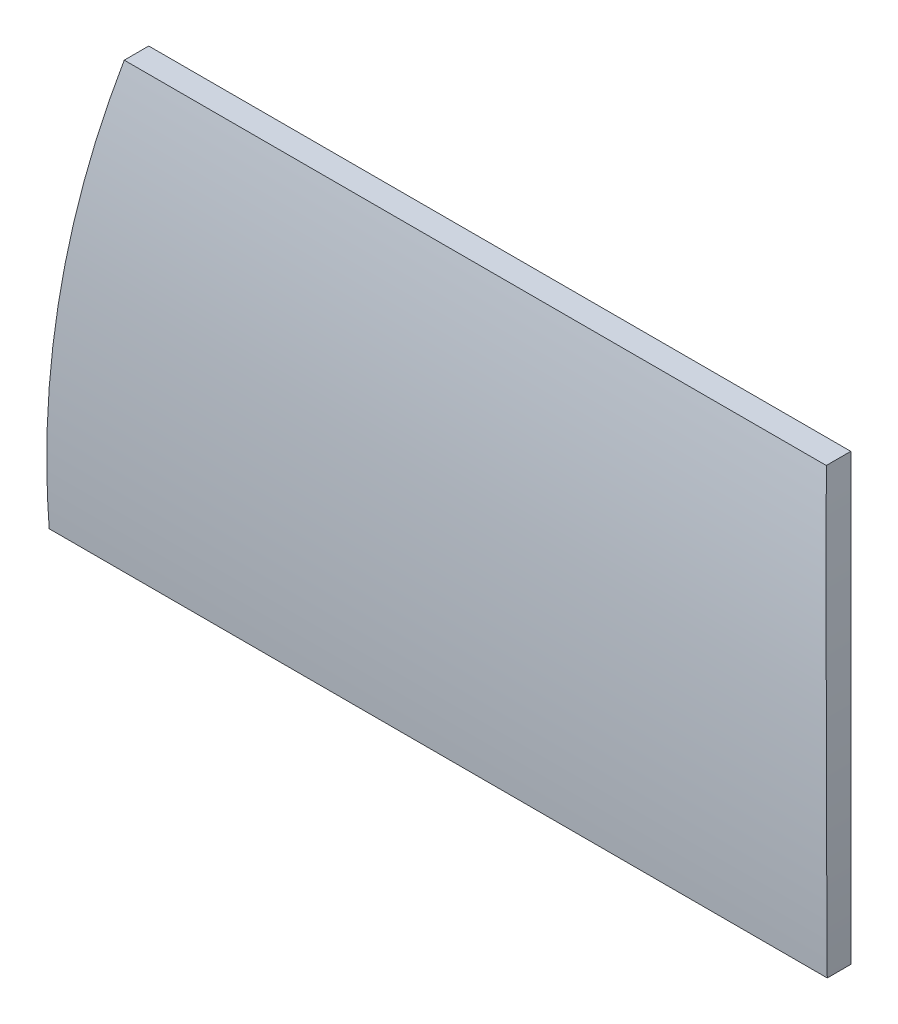
ISO-10303-21;
HEADER;
FILE_DESCRIPTION(('STEP AP214'),'2;1');
FILE_NAME('part.step','',(''),(''),'','','');
FILE_SCHEMA(('AUTOMOTIVE_DESIGN { 1 0 10303 214 1 1 1 1 }'));
ENDSEC;
DATA;
#1=APPLICATION_CONTEXT('core data for automotive mechanical design processes');
#2=APPLICATION_PROTOCOL_DEFINITION('international standard','automotive_design',2000,#1);
#3=PRODUCT_CONTEXT('',#1,'mechanical');
#4=PRODUCT('Part','Part','',(#3));
#5=PRODUCT_RELATED_PRODUCT_CATEGORY('part','',(#4));
#6=PRODUCT_DEFINITION_FORMATION('','',#4);
#7=PRODUCT_DEFINITION_CONTEXT('part definition',#1,'design');
#8=PRODUCT_DEFINITION('design','',#6,#7);
#9=PRODUCT_DEFINITION_SHAPE('','',#8);
#10=(LENGTH_UNIT() NAMED_UNIT(*) SI_UNIT(.MILLI.,.METRE.));
#11=(NAMED_UNIT(*) PLANE_ANGLE_UNIT() SI_UNIT($,.RADIAN.));
#12=(NAMED_UNIT(*) SI_UNIT($,.STERADIAN.) SOLID_ANGLE_UNIT());
#13=UNCERTAINTY_MEASURE_WITH_UNIT(LENGTH_MEASURE(1.E-05),#10,'distance_accuracy_value','');
#14=(GEOMETRIC_REPRESENTATION_CONTEXT(3) GLOBAL_UNCERTAINTY_ASSIGNED_CONTEXT((#13)) GLOBAL_UNIT_ASSIGNED_CONTEXT((#10,
#11,#12)) REPRESENTATION_CONTEXT('',''));
#15=CARTESIAN_POINT('',(0.,0.,0.));
#16=DIRECTION('',(0.,0.,1.));
#17=DIRECTION('',(1.,0.,0.));
#18=AXIS2_PLACEMENT_3D('',#15,#16,#17);
#19=CARTESIAN_POINT('',(5038.22117567225,182.044868634643,254.));
#20=DIRECTION('',(0.,0.,-1.));
#21=DIRECTION('',(-1.,0.,0.));
#22=AXIS2_PLACEMENT_3D('',#19,#20,#21);
#23=CYLINDRICAL_SURFACE('',#22,5041.50899525018);
#24=DIRECTION('',(0.,0.,-1.));
#25=VECTOR('',#24,1.);
#26=CARTESIAN_POINT('',(121.184130799503,1295.39999999999,254.));
#27=LINE('',#26,#25);
#28=CARTESIAN_POINT('',(121.184130799503,1295.4,-118.0703125));
#29=VERTEX_POINT('',#28);
#30=CARTESIAN_POINT('',(121.184130799503,1295.39999999999,-196.186778864413));
#31=VERTEX_POINT('',#30);
#32=EDGE_CURVE('E124',#29,#31,#27,.T.);
#33=ORIENTED_EDGE('',*,*,#32,.T.);
#34=CARTESIAN_POINT('',(121.184130799503,1295.4,-196.186778864414));
#35=CARTESIAN_POINT('',(118.221115439466,1282.31410462185,-193.224479559469));
#36=CARTESIAN_POINT('',(115.307918663472,1269.20567407987,-190.312389497769));
#37=CARTESIAN_POINT('',(109.581932582552,1242.94484784086,-184.589398003362));
#38=CARTESIAN_POINT('',(106.769143427457,1229.79245207826,-181.778496721651));
#39=CARTESIAN_POINT('',(98.4825772968622,1190.27113548249,-173.498765686505));
#40=CARTESIAN_POINT('',(93.1605786852689,1163.83798392849,-168.182885777828));
#41=CARTESIAN_POINT('',(82.9274486628202,1110.81084850003,-157.965117207028));
#42=CARTESIAN_POINT('',(78.0163458330862,1084.21685357535,-153.06325734312));
#43=CARTESIAN_POINT('',(68.6112513133622,1030.88137712413,-143.679773881506));
#44=CARTESIAN_POINT('',(64.1172580476436,1004.13989615516,-139.198148696265));
#45=CARTESIAN_POINT('',(55.5869880788214,950.741515216068,-130.69562823856));
#46=CARTESIAN_POINT('',(51.5472596707449,924.085720336932,-126.671255714952));
#47=CARTESIAN_POINT('',(43.888412007449,870.653330080227,-119.046199964671));
#48=CARTESIAN_POINT('',(40.2692929724297,843.876734639423,-115.44551695981));
#49=CARTESIAN_POINT('',(33.4562400780604,790.216171827955,-108.672420457143));
#50=CARTESIAN_POINT('',(30.2622952708098,763.332207240328,-105.499995931989));
#51=CARTESIAN_POINT('',(24.3034977992548,709.469416617735,-99.5873292916893));
#52=CARTESIAN_POINT('',(21.5386450652857,682.49059059817,-96.8470871063773));
#53=CARTESIAN_POINT('',(16.4412857213692,628.448674211627,-91.8020485178929));
#54=CARTESIAN_POINT('',(14.1088191901117,601.385576269495,-89.4972924803689));
#55=CARTESIAN_POINT('',(10.9369101230739,560.740734363327,-86.3692772021736));
#56=CARTESIAN_POINT('',(9.93406943974968,547.184042874319,-85.3814558434826));
#57=CARTESIAN_POINT('',(8.03759386240239,520.05519097933,-83.5157964681176));
#58=CARTESIAN_POINT('',(7.14396108684322,506.483030278424,-82.6379605849827));
#59=CARTESIAN_POINT('',(4.62736407892166,465.74647461893,-80.1699216635748));
#60=CARTESIAN_POINT('',(3.16866712979835,438.561570112356,-78.7451537884329));
#61=CARTESIAN_POINT('',(0.691301006645496,384.152120129975,-76.3387683287317));
#62=CARTESIAN_POINT('',(-0.327368271281696,356.927574663529,-75.3571506395375));
#63=CARTESIAN_POINT('',(-1.52767716167068,315.959670449025,-74.2149272833522));
#64=CARTESIAN_POINT('',(-1.87389881846635,302.2254236125,-73.8885719422796));
#65=CARTESIAN_POINT('',(-2.45407618802126,274.752603882815,-73.3489242365464));
#66=CARTESIAN_POINT('',(-2.68803406098709,261.014031077987,-73.1356296963345));
#67=CARTESIAN_POINT('',(-3.22139425303524,219.794022750555,-72.6654579680528));
#68=CARTESIAN_POINT('',(-3.35228825512356,192.308122942751,-72.5782878096098));
#69=CARTESIAN_POINT('',(-3.16452647037463,137.339603362732,-72.8567052395192));
#70=CARTESIAN_POINT('',(-2.84586168295231,109.856983667206,-73.2223018926664));
#71=CARTESIAN_POINT('',(-2.03107719094914,68.6474985255941,-74.1098981227518));
#72=CARTESIAN_POINT('',(-1.70334722840895,54.9133026022628,-74.4623011920405));
#73=CARTESIAN_POINT('',(-0.935747371030991,27.4513864684165,-75.2800539329857));
#74=CARTESIAN_POINT('',(-0.495877298152704,13.7236662682174,-75.7454037839633));
#75=CARTESIAN_POINT('',(-3.60991726964759E-13,0.,-76.2671652196317));
#76=B_SPLINE_CURVE_WITH_KNOTS('',3,(#34,#35,#36,#37,#38,#39,#40,#41,#42,#43,#44,#45,#46,#47,#48,
#49,#50,#51,#52,#53,#54,#55,#56,#57,#58,#59,#60,#61,#62,#63,#64,#65,#66,#67,#68,#69,#70,#71,#72,
#73,#74,#75),.UNSPECIFIED.,.F.,.F.,(4,2,2,2,2,2,2,2,2,2,2,2,2,2,2,2,2,2,2,2,4),(0.,
41.2204275967349,82.440916701345,164.881575516125,247.327963985612,329.77404098196,
411.543930196839,493.313862220216,575.081688324989,656.849501154437,738.624889410535,
779.512854613604,820.401612853884,902.177813838658,983.953995514739,1025.18064100615,
1066.40649317278,1148.85767409057,1231.31050578111,1272.53757201794,1313.7647037098),.UNSPECIFIED.);
#77=CARTESIAN_POINT('',(0.,0.,-76.2671652196312));
#78=VERTEX_POINT('',#77);
#79=EDGE_CURVE('E103',#31,#78,#76,.T.);
#80=ORIENTED_EDGE('',*,*,#79,.T.);
#81=DIRECTION('',(0.,0.,-1.));
#82=VECTOR('',#81,1.);
#83=CARTESIAN_POINT('',(0.,0.,254.));
#84=LINE('',#83,#82);
#85=CARTESIAN_POINT('',(0.,0.,0.));
#86=VERTEX_POINT('',#85);
#87=EDGE_CURVE('E12',#86,#78,#84,.T.);
#88=ORIENTED_EDGE('',*,*,#87,.F.);
#89=CARTESIAN_POINT('',(121.184130799503,1295.4,-118.070312500048));
#90=CARTESIAN_POINT('',(118.222026404955,1282.31812827414,-115.081454504868));
#91=CARTESIAN_POINT('',(115.309619961025,1269.21333670129,-112.144160054159));
#92=CARTESIAN_POINT('',(109.584997770868,1242.9590454181,-106.373489110249));
#93=CARTESIAN_POINT('',(106.772782180451,1229.80954563826,-103.540112778654));
#94=CARTESIAN_POINT('',(98.4876484520554,1190.29584250369,-95.1970820959398));
#95=CARTESIAN_POINT('',(93.1662208475184,1163.8663359792,-89.844503344341));
#96=CARTESIAN_POINT('',(82.9336499709987,1110.84386728118,-79.5645022036716));
#97=CARTESIAN_POINT('',(78.0225363895704,1084.25089342827,-74.6371105805364));
#98=CARTESIAN_POINT('',(68.6170294324553,1030.91520921865,-65.2139090981274));
#99=CARTESIAN_POINT('',(64.122634412866,1004.17249945306,-60.718097536322));
#100=CARTESIAN_POINT('',(55.5922692117017,950.775616428058,-52.1997031793543));
#101=CARTESIAN_POINT('',(51.5527576024814,924.122593773106,-48.1734544029935));
#102=CARTESIAN_POINT('',(43.8940628678766,870.694234671957,-40.5558900924704));
#103=CARTESIAN_POINT('',(40.2748799702462,843.918898159493,-36.9645747939757));
#104=CARTESIAN_POINT('',(33.4615351137984,790.259713738244,-30.2215740283534));
#105=CARTESIAN_POINT('',(30.2673616940583,763.375868775678,-27.0698767062557));
#106=CARTESIAN_POINT('',(24.3080285890408,709.512502845127,-21.2101147524507));
#107=CARTESIAN_POINT('',(21.542868831159,682.532981893335,-18.502050045665));
#108=CARTESIAN_POINT('',(16.4448773655741,628.489137937375,-13.5328897880371));
#109=CARTESIAN_POINT('',(14.1120870243218,601.424807070754,-11.2718370031724));
#110=CARTESIAN_POINT('',(10.9397214200687,560.778077281056,-8.21806807850602));
#111=CARTESIAN_POINT('',(9.93673334314634,547.220748832746,-7.25644411191174));
#112=CARTESIAN_POINT('',(8.03997465920212,520.090645141941,-5.4460813963491));
#113=CARTESIAN_POINT('',(7.14620622725752,506.517869597252,-4.5973448954718));
#114=CARTESIAN_POINT('',(4.62922364603932,465.779576028886,-2.22096303774464));
#115=CARTESIAN_POINT('',(3.17029819049197,438.593655308564,-0.863112575812943));
#116=CARTESIAN_POINT('',(0.692531093438734,384.182868907973,1.39779615223594));
#117=CARTESIAN_POINT('',(-0.326310648359895,356.95800323658,2.30085452199784));
#118=CARTESIAN_POINT('',(-1.52694776473789,315.9874197612,3.31624149396674));
#119=CARTESIAN_POINT('',(-1.87331034255172,302.250399127114,3.59863161012868));
#120=CARTESIAN_POINT('',(-2.45371984763108,274.772362980493,4.04734532895626));
#121=CARTESIAN_POINT('',(-2.68776899417163,261.031347552263,4.21367122504071));
#122=CARTESIAN_POINT('',(-3.22133974556373,219.804567241961,4.53843616635687));
#123=CARTESIAN_POINT('',(-3.35228986558498,192.314890799289,4.52266686566215));
#124=CARTESIAN_POINT('',(-3.16455178123843,137.340717672844,4.02641890253426));
#125=CARTESIAN_POINT('',(-2.84585453320975,109.856221104372,3.5459308933747));
#126=CARTESIAN_POINT('',(-2.03103683713776,68.6456580531142,2.47709556795824));
#127=CARTESIAN_POINT('',(-1.70329831795554,54.9113904696879,2.06279518394034));
#128=CARTESIAN_POINT('',(-0.935702771870011,27.4499531922266,1.11829142170658));
#129=CARTESIAN_POINT('',(-0.495845564628725,13.722783509644,0.588087857065748));
#130=CARTESIAN_POINT('',(1.48356032347106E-13,-2.14120792028841E-13,4.88757059906581E-11));
#131=B_SPLINE_CURVE_WITH_KNOTS('',3,(#89,#90,#91,#92,#93,#94,#95,#96,#97,#98,#99,#100,#101,#102,
#103,#104,#105,#106,#107,#108,#109,#110,#111,#112,#113,#114,#115,#116,#117,#118,#119,#120,#121,
#122,#123,#124,#125,#126,#127,#128,#129,#130),.UNSPECIFIED.,.F.,.F.,(4,2,2,2,2,2,2,2,2,2,2,2,2,
2,2,2,2,2,2,2,4),(0.,41.2255875550279,82.4512392187781,164.902229436645,247.359180696758,
329.815806660713,411.578120487007,493.34047861581,575.100631471322,656.860770490097,
738.628727783608,779.512984984878,820.398056251513,902.166884168106,983.935693450006,
1025.16772300464,1066.39893779492,1148.86083451328,1231.32438979369,1272.55682950433,
1313.78933553597),.UNSPECIFIED.);
#132=EDGE_CURVE('E140',#29,#86,#131,.T.);
#133=ORIENTED_EDGE('',*,*,#132,.F.);
#134=EDGE_LOOP('',(#33,#80,#88,#133));
#135=FACE_BOUND('',#134,.T.);
#136=ADVANCED_FACE('F80',(#135),#23,.T.);
#137=CARTESIAN_POINT('',(0.,0.,254.));
#138=DIRECTION('',(0.,1.,0.));
#139=DIRECTION('',(0.,0.,1.));
#140=AXIS2_PLACEMENT_3D('',#137,#138,#139);
#141=PLANE('',#140);
#142=ORIENTED_EDGE('',*,*,#87,.T.);
#143=DIRECTION('',(1.,0.,0.));
#144=VECTOR('',#143,1.);
#145=CARTESIAN_POINT('',(-3.28781957792934,0.,-76.2671652196312));
#146=LINE('',#145,#144);
#147=CARTESIAN_POINT('',(2480.50704701796,0.,-76.2671652196312));
#148=VERTEX_POINT('',#147);
#149=EDGE_CURVE('E128',#78,#148,#146,.T.);
#150=ORIENTED_EDGE('',*,*,#149,.T.);
#151=DIRECTION('',(0.,0.,-1.));
#152=VECTOR('',#151,1.);
#153=CARTESIAN_POINT('',(2480.50704701796,1.66533453693773E-12,254.));
#154=LINE('',#153,#152);
#155=CARTESIAN_POINT('',(2480.50704701796,0.,0.));
#156=VERTEX_POINT('',#155);
#157=EDGE_CURVE('E88',#156,#148,#154,.T.);
#158=ORIENTED_EDGE('',*,*,#157,.F.);
#159=DIRECTION('',(1.,0.,0.));
#160=VECTOR('',#159,1.);
#161=CARTESIAN_POINT('',(-3.28781957792934,0.,0.));
#162=LINE('',#161,#160);
#163=EDGE_CURVE('E138',#86,#156,#162,.T.);
#164=ORIENTED_EDGE('',*,*,#163,.F.);
#165=EDGE_LOOP('',(#142,#150,#158,#164));
#166=FACE_BOUND('',#165,.T.);
#167=ADVANCED_FACE('F137',(#166),#141,.F.);
#168=CARTESIAN_POINT('',(-2557.71412865429,182.044868634643,254.));
#169=DIRECTION('',(0.,0.,-1.));
#170=DIRECTION('',(-1.,0.,0.));
#171=AXIS2_PLACEMENT_3D('',#168,#169,#170);
#172=CYLINDRICAL_SURFACE('',#171,5041.50899525018);
#173=ORIENTED_EDGE('',*,*,#157,.T.);
#174=CARTESIAN_POINT('',(2480.50704701796,3.88578058618805E-12,-76.2671652196314));
#175=CARTESIAN_POINT('',(2481.00292431611,13.7236662682211,-75.7454037839621));
#176=CARTESIAN_POINT('',(2481.44279438899,27.4513864684202,-75.2800539329845));
#177=CARTESIAN_POINT('',(2482.21039424637,54.9133026022664,-74.4623011920397));
#178=CARTESIAN_POINT('',(2482.53812420891,68.6474985255977,-74.1098981227515));
#179=CARTESIAN_POINT('',(2483.35290870091,109.856983667209,-73.222301892667));
#180=CARTESIAN_POINT('',(2483.67157348833,137.339603362736,-72.8567052395194));
#181=CARTESIAN_POINT('',(2483.85933527308,192.308122942754,-72.5782878096097));
#182=CARTESIAN_POINT('',(2483.728441271,219.794022750558,-72.6654579680528));
#183=CARTESIAN_POINT('',(2483.19508107895,261.01403107799,-73.1356296963345));
#184=CARTESIAN_POINT('',(2482.96112320598,274.752603882818,-73.3489242365464));
#185=CARTESIAN_POINT('',(2482.38094583643,302.225423612503,-73.8885719422797));
#186=CARTESIAN_POINT('',(2482.03472417963,315.959670449028,-74.2149272833524));
#187=CARTESIAN_POINT('',(2480.83441528924,356.927574663532,-75.3571506395376));
#188=CARTESIAN_POINT('',(2479.81574601131,384.152120129978,-76.3387683287311));
#189=CARTESIAN_POINT('',(2477.33837988816,438.561570112359,-78.7451537884334));
#190=CARTESIAN_POINT('',(2475.87968293904,465.746474618932,-80.1699216635771));
#191=CARTESIAN_POINT('',(2473.36308593112,506.483030278427,-82.6379605849834));
#192=CARTESIAN_POINT('',(2472.46945315556,520.055190979333,-83.515796468117));
#193=CARTESIAN_POINT('',(2470.57297757821,547.184042874321,-85.3814558434819));
#194=CARTESIAN_POINT('',(2469.57013689489,560.74073436333,-86.369277202174));
#195=CARTESIAN_POINT('',(2466.39822782785,601.385576269497,-89.4972924803708));
#196=CARTESIAN_POINT('',(2464.06576129659,628.448674211629,-91.8020485178937));
#197=CARTESIAN_POINT('',(2458.96840195267,682.490590598172,-96.8470871063771));
#198=CARTESIAN_POINT('',(2456.20354921871,709.469416617736,-99.5873292916894));
#199=CARTESIAN_POINT('',(2450.24475174715,763.33220724033,-105.499995931989));
#200=CARTESIAN_POINT('',(2447.0508069399,790.216171827957,-108.672420457143));
#201=CARTESIAN_POINT('',(2440.23775404553,843.876734639425,-115.44551695981));
#202=CARTESIAN_POINT('',(2436.61863501051,870.653330080228,-119.046199964671));
#203=CARTESIAN_POINT('',(2428.95978734722,924.085720336934,-126.671255714952));
#204=CARTESIAN_POINT('',(2424.92005893914,950.74151521607,-130.695628238559));
#205=CARTESIAN_POINT('',(2416.38978897032,1004.13989615517,-139.198148696265));
#206=CARTESIAN_POINT('',(2411.8957957046,1030.88137712413,-143.679773881507));
#207=CARTESIAN_POINT('',(2402.49070118487,1084.21685357535,-153.063257343121));
#208=CARTESIAN_POINT('',(2397.57959835514,1110.81084850003,-157.965117207029));
#209=CARTESIAN_POINT('',(2387.34646833269,1163.83798392849,-168.182885777828));
#210=CARTESIAN_POINT('',(2382.0244697211,1190.27113548249,-173.498765686506));
#211=CARTESIAN_POINT('',(2373.7379035905,1229.79245207826,-181.778496721651));
#212=CARTESIAN_POINT('',(2370.92511443541,1242.94484784086,-184.589398003362));
#213=CARTESIAN_POINT('',(2365.19912835449,1269.20567407987,-190.312389497769));
#214=CARTESIAN_POINT('',(2362.28593157849,1282.31410462185,-193.224479559469));
#215=CARTESIAN_POINT('',(2359.32291621846,1295.4,-196.186778864413));
#216=B_SPLINE_CURVE_WITH_KNOTS('',3,(#174,#175,#176,#177,#178,#179,#180,#181,#182,#183,#184,
#185,#186,#187,#188,#189,#190,#191,#192,#193,#194,#195,#196,#197,#198,#199,#200,#201,#202,#203,
#204,#205,#206,#207,#208,#209,#210,#211,#212,#213,#214,#215),.UNSPECIFIED.,.F.,.F.,(4,2,2,2,2,2,
2,2,2,2,2,2,2,2,2,2,2,2,2,2,4),(0.,41.2271316918526,82.4541979286816,164.907029619227,
247.35821053702,288.584062703641,329.810708195057,411.586889871137,493.363090855912,
534.251849096191,575.13981429926,656.915202555358,738.683015384806,820.450841489578,
902.220773512955,983.990662727834,1066.43673972418,1148.88312819367,1231.32378700845,
1272.54427611306,1313.76470370979),.UNSPECIFIED.);
#217=CARTESIAN_POINT('',(2359.32291621846,1295.4,-196.186778864413));
#218=VERTEX_POINT('',#217);
#219=EDGE_CURVE('E125',#148,#218,#216,.T.);
#220=ORIENTED_EDGE('',*,*,#219,.T.);
#221=DIRECTION('',(0.,0.,-1.));
#222=VECTOR('',#221,1.);
#223=CARTESIAN_POINT('',(2359.32291621846,1295.39999999999,254.));
#224=LINE('',#223,#222);
#225=CARTESIAN_POINT('',(2359.32291621846,1295.39999999999,-118.070312500048));
#226=VERTEX_POINT('',#225);
#227=EDGE_CURVE('E212',#226,#218,#224,.T.);
#228=ORIENTED_EDGE('',*,*,#227,.F.);
#229=CARTESIAN_POINT('',(2480.50704701796,3.88578058618805E-12,4.88498130835069E-11));
#230=CARTESIAN_POINT('',(2481.00289258259,13.722783509648,0.588087857066509));
#231=CARTESIAN_POINT('',(2481.44274978983,27.4499531922305,1.11829142170739));
#232=CARTESIAN_POINT('',(2482.21034533592,54.9113904696917,2.06279518394078));
#233=CARTESIAN_POINT('',(2482.5380838551,68.645658053118,2.47709556795826));
#234=CARTESIAN_POINT('',(2483.35290155117,109.856221104376,3.54593089337429));
#235=CARTESIAN_POINT('',(2483.6715987992,137.340717672847,4.02641890253467));
#236=CARTESIAN_POINT('',(2483.85933688355,192.314890799292,4.52266686566176));
#237=CARTESIAN_POINT('',(2483.72838676352,219.804567241964,4.53843616635486));
#238=CARTESIAN_POINT('',(2483.19481601213,261.031347552266,4.21367122503994));
#239=CARTESIAN_POINT('',(2482.96076686559,274.772362980496,4.04734532895651));
#240=CARTESIAN_POINT('',(2482.38035736051,302.250399127117,3.59863161012871));
#241=CARTESIAN_POINT('',(2482.0339947827,315.987419761203,3.31624149396551));
#242=CARTESIAN_POINT('',(2480.83335766632,356.958003236583,2.30085452199512));
#243=CARTESIAN_POINT('',(2479.81451592452,384.182868907975,1.39779615223518));
#244=CARTESIAN_POINT('',(2477.33674882747,438.593655308567,-0.863112575812306));
#245=CARTESIAN_POINT('',(2475.87782337192,465.779576028888,-2.22096303774458));
#246=CARTESIAN_POINT('',(2473.3608407907,506.517869597255,-4.59734489547173));
#247=CARTESIAN_POINT('',(2472.46707235876,520.090645141943,-5.44608139634889));
#248=CARTESIAN_POINT('',(2470.57031367481,547.220748832748,-7.25644411191142));
#249=CARTESIAN_POINT('',(2469.56732559789,560.778077281058,-8.21806807850573));
#250=CARTESIAN_POINT('',(2466.39495999364,601.424807070755,-11.2718370031721));
#251=CARTESIAN_POINT('',(2464.06216965239,628.489137937376,-13.532889788037));
#252=CARTESIAN_POINT('',(2458.9641781868,682.532981893336,-18.502050045665));
#253=CARTESIAN_POINT('',(2456.19901842892,709.512502845129,-21.2101147524507));
#254=CARTESIAN_POINT('',(2450.2396853239,763.37586877568,-27.0698767062553));
#255=CARTESIAN_POINT('',(2447.04551190416,790.259713738245,-30.2215740283526));
#256=CARTESIAN_POINT('',(2440.23216704771,843.918898159494,-36.9645747939757));
#257=CARTESIAN_POINT('',(2436.61298415008,870.694234671957,-40.5558900924718));
#258=CARTESIAN_POINT('',(2428.95428941548,924.122593773106,-48.173454402995));
#259=CARTESIAN_POINT('',(2424.91477780626,950.775616428058,-52.1997031793546));
#260=CARTESIAN_POINT('',(2416.38441260509,1004.17249945306,-60.7180975363213));
#261=CARTESIAN_POINT('',(2411.8900175855,1030.91520921865,-65.2139090981271));
#262=CARTESIAN_POINT('',(2402.48451062839,1084.25089342827,-74.6371105805365));
#263=CARTESIAN_POINT('',(2397.57339704696,1110.84386728118,-79.5645022036717));
#264=CARTESIAN_POINT('',(2387.34082617044,1163.8663359792,-89.844503344341));
#265=CARTESIAN_POINT('',(2382.0193985659,1190.29584250369,-95.1970820959396));
#266=CARTESIAN_POINT('',(2373.73426483751,1229.80954563826,-103.540112778654));
#267=CARTESIAN_POINT('',(2370.92204924709,1242.9590454181,-106.373489110249));
#268=CARTESIAN_POINT('',(2365.19742705694,1269.21333670129,-112.144160054159));
#269=CARTESIAN_POINT('',(2362.28502061301,1282.31812827414,-115.081454504868));
#270=CARTESIAN_POINT('',(2359.32291621846,1295.39999999999,-118.070312500047));
#271=B_SPLINE_CURVE_WITH_KNOTS('',3,(#229,#230,#231,#232,#233,#234,#235,#236,#237,#238,#239,
#240,#241,#242,#243,#244,#245,#246,#247,#248,#249,#250,#251,#252,#253,#254,#255,#256,#257,#258,
#259,#260,#261,#262,#263,#264,#265,#266,#267,#268,#269,#270),.UNSPECIFIED.,.F.,.F.,(4,2,2,2,2,2,
2,2,2,2,2,2,2,2,2,2,2,2,2,2,4),(0.,41.2325060316327,82.4649457422798,164.92850102269,
247.390397741048,288.621612531321,329.853642085959,411.622451367859,493.391279284452,
534.276350551087,575.160607752357,656.928565045867,738.688704064641,820.448856920154,
902.211215048956,983.973528875249,1066.4301548392,1148.88710609932,1231.33809631718,
1272.56374798093,1313.78933553596),.UNSPECIFIED.);
#272=EDGE_CURVE('E95',#156,#226,#271,.T.);
#273=ORIENTED_EDGE('',*,*,#272,.F.);
#274=EDGE_LOOP('',(#173,#220,#228,#273));
#275=FACE_BOUND('',#274,.T.);
#276=ADVANCED_FACE('F154',(#275),#172,.T.);
#277=CARTESIAN_POINT('',(121.184130799503,1295.39999999999,254.));
#278=DIRECTION('',(0.,-1.,0.));
#279=DIRECTION('',(0.,0.,-1.));
#280=AXIS2_PLACEMENT_3D('',#277,#278,#279);
#281=PLANE('',#280);
#282=ORIENTED_EDGE('',*,*,#227,.T.);
#283=DIRECTION('',(1.,0.,0.));
#284=VECTOR('',#283,1.);
#285=CARTESIAN_POINT('',(-3.28781957792934,1295.4,-196.186778864413));
#286=LINE('',#285,#284);
#287=EDGE_CURVE('E134',#31,#218,#286,.T.);
#288=ORIENTED_EDGE('',*,*,#287,.F.);
#289=ORIENTED_EDGE('',*,*,#32,.F.);
#290=DIRECTION('',(1.,0.,0.));
#291=VECTOR('',#290,1.);
#292=CARTESIAN_POINT('',(-3.28781957792934,1295.4,-118.0703125));
#293=LINE('',#292,#291);
#294=EDGE_CURVE('E133',#29,#226,#293,.T.);
#295=ORIENTED_EDGE('',*,*,#294,.T.);
#296=EDGE_LOOP('',(#282,#288,#289,#295));
#297=FACE_BOUND('',#296,.T.);
#298=ADVANCED_FACE('F161',(#297),#281,.F.);
#299=CARTESIAN_POINT('',(-3.28781957792934,208.861419048448,-4873.72130154307));
#300=DIRECTION('',(1.,0.,0.));
#301=DIRECTION('',(0.,0.,-1.));
#302=AXIS2_PLACEMENT_3D('',#299,#300,#301);
#303=CYLINDRICAL_SURFACE('',#302,4878.19458585674);
#304=ORIENTED_EDGE('',*,*,#132,.T.);
#305=ORIENTED_EDGE('',*,*,#163,.T.);
#306=ORIENTED_EDGE('',*,*,#272,.T.);
#307=ORIENTED_EDGE('',*,*,#294,.F.);
#308=EDGE_LOOP('',(#304,#305,#306,#307));
#309=FACE_BOUND('',#308,.T.);
#310=ADVANCED_FACE('F157',(#309),#303,.T.);
#311=CARTESIAN_POINT('',(-3.28781957792934,190.178521981645,-5078.48207620329));
#312=DIRECTION('',(1.,0.,0.));
#313=DIRECTION('',(0.,0.,-1.));
#314=AXIS2_PLACEMENT_3D('',#311,#312,#313);
#315=CYLINDRICAL_SURFACE('',#314,5005.82879110846);
#316=ORIENTED_EDGE('',*,*,#287,.T.);
#317=ORIENTED_EDGE('',*,*,#219,.F.);
#318=ORIENTED_EDGE('',*,*,#149,.F.);
#319=ORIENTED_EDGE('',*,*,#79,.F.);
#320=EDGE_LOOP('',(#316,#317,#318,#319));
#321=FACE_BOUND('',#320,.T.);
#322=ADVANCED_FACE('F129',(#321),#315,.F.);
#323=CLOSED_SHELL('',(#136,#167,#276,#298,#310,#322));
#324=MANIFOLD_SOLID_BREP('B2',#323);
#325=ADVANCED_BREP_SHAPE_REPRESENTATION('',(#18,#324),#14);
#326=SHAPE_DEFINITION_REPRESENTATION(#9,#325);
ENDSEC;
END-ISO-10303-21;
